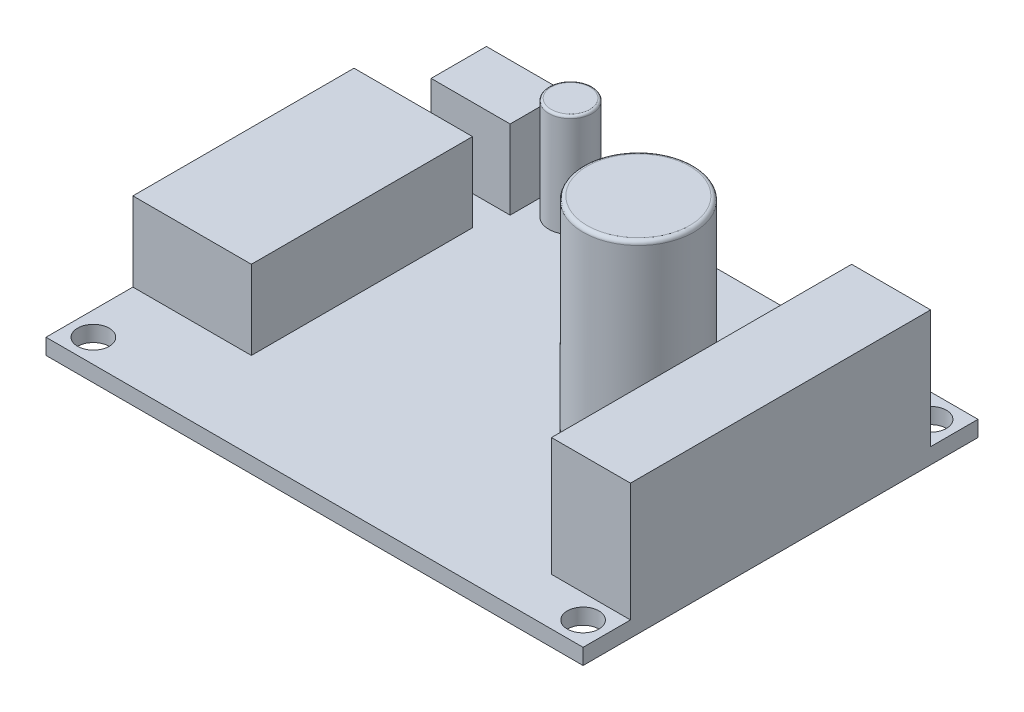
ISO-10303-21;
HEADER;
FILE_DESCRIPTION(('STEP AP214'),'2;1');
FILE_NAME('part.step','',(''),(''),'','','');
FILE_SCHEMA(('AUTOMOTIVE_DESIGN { 1 0 10303 214 1 1 1 1 }'));
ENDSEC;
DATA;
#1=APPLICATION_CONTEXT('core data for automotive mechanical design processes');
#2=APPLICATION_PROTOCOL_DEFINITION('international standard','automotive_design',2000,#1);
#3=PRODUCT_CONTEXT('',#1,'mechanical');
#4=PRODUCT('Part','Part','',(#3));
#5=PRODUCT_RELATED_PRODUCT_CATEGORY('part','',(#4));
#6=PRODUCT_DEFINITION_FORMATION('','',#4);
#7=PRODUCT_DEFINITION_CONTEXT('part definition',#1,'design');
#8=PRODUCT_DEFINITION('design','',#6,#7);
#9=PRODUCT_DEFINITION_SHAPE('','',#8);
#10=(LENGTH_UNIT() NAMED_UNIT(*) SI_UNIT(.MILLI.,.METRE.));
#11=(NAMED_UNIT(*) PLANE_ANGLE_UNIT() SI_UNIT($,.RADIAN.));
#12=(NAMED_UNIT(*) SI_UNIT($,.STERADIAN.) SOLID_ANGLE_UNIT());
#13=UNCERTAINTY_MEASURE_WITH_UNIT(LENGTH_MEASURE(1.E-05),#10,'distance_accuracy_value','');
#14=(GEOMETRIC_REPRESENTATION_CONTEXT(3) GLOBAL_UNCERTAINTY_ASSIGNED_CONTEXT((#13)) GLOBAL_UNIT_ASSIGNED_CONTEXT((#10,
#11,#12)) REPRESENTATION_CONTEXT('',''));
#15=CARTESIAN_POINT('',(0.,0.,0.));
#16=DIRECTION('',(0.,0.,1.));
#17=DIRECTION('',(1.,0.,0.));
#18=AXIS2_PLACEMENT_3D('',#15,#16,#17);
#19=CARTESIAN_POINT('',(0.,2.,0.));
#20=DIRECTION('',(0.,-1.,0.));
#21=DIRECTION('',(0.,0.,-1.));
#22=AXIS2_PLACEMENT_3D('',#19,#20,#21);
#23=PLANE('',#22);
#24=CARTESIAN_POINT('',(-14.,2.,-21.4113766525952));
#25=DIRECTION('',(0.,-1.,0.));
#26=DIRECTION('',(0.,0.,-1.));
#27=AXIS2_PLACEMENT_3D('',#24,#25,#26);
#28=CIRCLE('',#27,2.75);
#29=CARTESIAN_POINT('',(-14.,2.,-24.1613766525952));
#30=VERTEX_POINT('',#29);
#31=EDGE_CURVE('E295',#30,#30,#28,.F.);
#32=ORIENTED_EDGE('',*,*,#31,.F.);
#33=EDGE_LOOP('',(#32));
#34=FACE_BOUND('',#33,.T.);
#35=DIRECTION('',(-1.,0.,0.));
#36=VECTOR('',#35,1.);
#37=CARTESIAN_POINT('',(-34.,2.,-14.));
#38=LINE('',#37,#36);
#39=CARTESIAN_POINT('',(-19.,2.,-14.));
#40=VERTEX_POINT('',#39);
#41=CARTESIAN_POINT('',(-34.,2.,-14.));
#42=VERTEX_POINT('',#41);
#43=EDGE_CURVE('E169',#40,#42,#38,.T.);
#44=ORIENTED_EDGE('',*,*,#43,.F.);
#45=DIRECTION('',(0.,0.,-1.));
#46=VECTOR('',#45,1.);
#47=CARTESIAN_POINT('',(-19.,2.,14.));
#48=LINE('',#47,#46);
#49=CARTESIAN_POINT('',(-19.,2.,14.));
#50=VERTEX_POINT('',#49);
#51=EDGE_CURVE('E166',#50,#40,#48,.T.);
#52=ORIENTED_EDGE('',*,*,#51,.F.);
#53=DIRECTION('',(1.,0.,0.));
#54=VECTOR('',#53,1.);
#55=CARTESIAN_POINT('',(-34.,2.,14.));
#56=LINE('',#55,#54);
#57=CARTESIAN_POINT('',(-34.,2.,14.));
#58=VERTEX_POINT('',#57);
#59=EDGE_CURVE('E179',#58,#50,#56,.T.);
#60=ORIENTED_EDGE('',*,*,#59,.F.);
#61=DIRECTION('',(0.,0.,1.));
#62=VECTOR('',#61,1.);
#63=CARTESIAN_POINT('',(-34.,2.,25.));
#64=LINE('',#63,#62);
#65=CARTESIAN_POINT('',(-34.,2.,25.));
#66=VERTEX_POINT('',#65);
#67=EDGE_CURVE('E261',#58,#66,#64,.T.);
#68=ORIENTED_EDGE('',*,*,#67,.T.);
#69=DIRECTION('',(1.,0.,0.));
#70=VECTOR('',#69,1.);
#71=CARTESIAN_POINT('',(-34.,2.,25.));
#72=LINE('',#71,#70);
#73=CARTESIAN_POINT('',(34.,2.,25.));
#74=VERTEX_POINT('',#73);
#75=EDGE_CURVE('E264',#66,#74,#72,.T.);
#76=ORIENTED_EDGE('',*,*,#75,.T.);
#77=DIRECTION('',(0.,0.,-1.));
#78=VECTOR('',#77,1.);
#79=CARTESIAN_POINT('',(34.,2.,25.));
#80=LINE('',#79,#78);
#81=CARTESIAN_POINT('',(34.,2.,19.));
#82=VERTEX_POINT('',#81);
#83=EDGE_CURVE('E256',#74,#82,#80,.T.);
#84=ORIENTED_EDGE('',*,*,#83,.T.);
#85=DIRECTION('',(1.,0.,0.));
#86=VECTOR('',#85,1.);
#87=CARTESIAN_POINT('',(24.,2.,19.));
#88=LINE('',#87,#86);
#89=CARTESIAN_POINT('',(24.,2.,19.));
#90=VERTEX_POINT('',#89);
#91=EDGE_CURVE('E201',#90,#82,#88,.T.);
#92=ORIENTED_EDGE('',*,*,#91,.F.);
#93=DIRECTION('',(0.,0.,1.));
#94=VECTOR('',#93,1.);
#95=CARTESIAN_POINT('',(24.,2.,19.));
#96=LINE('',#95,#94);
#97=CARTESIAN_POINT('',(24.,2.,-19.));
#98=VERTEX_POINT('',#97);
#99=EDGE_CURVE('E206',#98,#90,#96,.T.);
#100=ORIENTED_EDGE('',*,*,#99,.F.);
#101=DIRECTION('',(-1.,0.,0.));
#102=VECTOR('',#101,1.);
#103=CARTESIAN_POINT('',(24.,2.,-19.));
#104=LINE('',#103,#102);
#105=CARTESIAN_POINT('',(34.,2.,-19.));
#106=VERTEX_POINT('',#105);
#107=EDGE_CURVE('E215',#106,#98,#104,.T.);
#108=ORIENTED_EDGE('',*,*,#107,.F.);
#109=CARTESIAN_POINT('',(34.,2.,-25.));
#110=VERTEX_POINT('',#109);
#111=EDGE_CURVE('E259',#106,#110,#80,.T.);
#112=ORIENTED_EDGE('',*,*,#111,.T.);
#113=DIRECTION('',(-1.,0.,0.));
#114=VECTOR('',#113,1.);
#115=CARTESIAN_POINT('',(-34.,2.,-25.));
#116=LINE('',#115,#114);
#117=CARTESIAN_POINT('',(-34.,2.,-25.));
#118=VERTEX_POINT('',#117);
#119=EDGE_CURVE('E258',#110,#118,#116,.T.);
#120=ORIENTED_EDGE('',*,*,#119,.T.);
#121=EDGE_CURVE('E262',#118,#42,#64,.T.);
#122=ORIENTED_EDGE('',*,*,#121,.T.);
#123=EDGE_LOOP('',(#44,#52,#60,#68,#76,#84,#92,#100,#108,#112,#120,#122));
#124=FACE_BOUND('',#123,.T.);
#125=CARTESIAN_POINT('',(-31.,2.,22.));
#126=DIRECTION('',(0.,1.,0.));
#127=DIRECTION('',(0.,0.,-1.));
#128=AXIS2_PLACEMENT_3D('',#125,#126,#127);
#129=CIRCLE('',#128,2.);
#130=CARTESIAN_POINT('',(-31.,2.,20.));
#131=VERTEX_POINT('',#130);
#132=EDGE_CURVE('E232',#131,#131,#129,.T.);
#133=ORIENTED_EDGE('',*,*,#132,.F.);
#134=EDGE_LOOP('',(#133));
#135=FACE_BOUND('',#134,.T.);
#136=CARTESIAN_POINT('',(31.,2.,22.));
#137=DIRECTION('',(0.,1.,0.));
#138=DIRECTION('',(0.,0.,1.));
#139=AXIS2_PLACEMENT_3D('',#136,#137,#138);
#140=CIRCLE('',#139,2.);
#141=CARTESIAN_POINT('',(31.,2.,24.));
#142=VERTEX_POINT('',#141);
#143=EDGE_CURVE('E238',#142,#142,#140,.T.);
#144=ORIENTED_EDGE('',*,*,#143,.F.);
#145=EDGE_LOOP('',(#144));
#146=FACE_BOUND('',#145,.T.);
#147=CARTESIAN_POINT('',(31.,2.,-22.));
#148=DIRECTION('',(0.,1.,0.));
#149=DIRECTION('',(0.,0.,-1.));
#150=AXIS2_PLACEMENT_3D('',#147,#148,#149);
#151=CIRCLE('',#150,2.);
#152=CARTESIAN_POINT('',(31.,2.,-24.));
#153=VERTEX_POINT('',#152);
#154=EDGE_CURVE('E244',#153,#153,#151,.T.);
#155=ORIENTED_EDGE('',*,*,#154,.F.);
#156=EDGE_LOOP('',(#155));
#157=FACE_BOUND('',#156,.T.);
#158=CARTESIAN_POINT('',(-31.,2.,-22.));
#159=DIRECTION('',(0.,1.,0.));
#160=DIRECTION('',(0.,0.,1.));
#161=AXIS2_PLACEMENT_3D('',#158,#159,#160);
#162=CIRCLE('',#161,2.);
#163=CARTESIAN_POINT('',(-31.,2.,-20.));
#164=VERTEX_POINT('',#163);
#165=EDGE_CURVE('E250',#164,#164,#162,.T.);
#166=ORIENTED_EDGE('',*,*,#165,.F.);
#167=EDGE_LOOP('',(#166));
#168=FACE_BOUND('',#167,.T.);
#169=CARTESIAN_POINT('',(16.,2.,0.));
#170=DIRECTION('',(0.,-1.,0.));
#171=DIRECTION('',(0.,0.,-1.));
#172=AXIS2_PLACEMENT_3D('',#169,#170,#171);
#173=CIRCLE('',#172,7.);
#174=CARTESIAN_POINT('',(16.,2.,-7.));
#175=VERTEX_POINT('',#174);
#176=EDGE_CURVE('E286',#175,#175,#173,.F.);
#177=ORIENTED_EDGE('',*,*,#176,.F.);
#178=EDGE_LOOP('',(#177));
#179=FACE_BOUND('',#178,.T.);
#180=DIRECTION('',(0.,0.,-1.));
#181=VECTOR('',#180,1.);
#182=CARTESIAN_POINT('',(-18.0015410763829,2.,-17.7629399990859));
#183=LINE('',#182,#181);
#184=CARTESIAN_POINT('',(-18.0015410763829,2.,-17.7629399990859));
#185=VERTEX_POINT('',#184);
#186=CARTESIAN_POINT('',(-18.0015410763829,2.,-24.7629399990859));
#187=VERTEX_POINT('',#186);
#188=EDGE_CURVE('E165',#185,#187,#183,.T.);
#189=ORIENTED_EDGE('',*,*,#188,.F.);
#190=DIRECTION('',(1.,0.,0.));
#191=VECTOR('',#190,1.);
#192=CARTESIAN_POINT('',(-28.0015410763829,2.,-17.7629399990859));
#193=LINE('',#192,#191);
#194=CARTESIAN_POINT('',(-28.0015410763829,2.,-17.7629399990859));
#195=VERTEX_POINT('',#194);
#196=EDGE_CURVE('E162',#195,#185,#193,.T.);
#197=ORIENTED_EDGE('',*,*,#196,.F.);
#198=DIRECTION('',(0.,0.,1.));
#199=VECTOR('',#198,1.);
#200=CARTESIAN_POINT('',(-28.0015410763829,2.,-17.7629399990859));
#201=LINE('',#200,#199);
#202=CARTESIAN_POINT('',(-28.0015410763829,2.,-24.7629399990859));
#203=VERTEX_POINT('',#202);
#204=EDGE_CURVE('E52',#203,#195,#201,.T.);
#205=ORIENTED_EDGE('',*,*,#204,.F.);
#206=DIRECTION('',(-1.,0.,0.));
#207=VECTOR('',#206,1.);
#208=CARTESIAN_POINT('',(-28.0015410763829,2.,-24.7629399990859));
#209=LINE('',#208,#207);
#210=EDGE_CURVE('E47',#187,#203,#209,.T.);
#211=ORIENTED_EDGE('',*,*,#210,.F.);
#212=EDGE_LOOP('',(#189,#197,#205,#211));
#213=FACE_BOUND('',#212,.T.);
#214=ADVANCED_FACE('F32',(#34,#124,#135,#146,#157,#168,#179,#213),#23,.F.);
#215=CARTESIAN_POINT('',(0.,0.,0.));
#216=DIRECTION('',(0.,-1.,0.));
#217=DIRECTION('',(0.,0.,-1.));
#218=AXIS2_PLACEMENT_3D('',#215,#216,#217);
#219=PLANE('',#218);
#220=CARTESIAN_POINT('',(31.,0.,22.));
#221=DIRECTION('',(0.,1.,0.));
#222=DIRECTION('',(0.,0.,1.));
#223=AXIS2_PLACEMENT_3D('',#220,#221,#222);
#224=CIRCLE('',#223,2.);
#225=CARTESIAN_POINT('',(31.,0.,24.));
#226=VERTEX_POINT('',#225);
#227=EDGE_CURVE('E235',#226,#226,#224,.T.);
#228=ORIENTED_EDGE('',*,*,#227,.T.);
#229=EDGE_LOOP('',(#228));
#230=FACE_BOUND('',#229,.T.);
#231=CARTESIAN_POINT('',(-31.,0.,-22.));
#232=DIRECTION('',(0.,1.,0.));
#233=DIRECTION('',(0.,0.,1.));
#234=AXIS2_PLACEMENT_3D('',#231,#232,#233);
#235=CIRCLE('',#234,2.);
#236=CARTESIAN_POINT('',(-31.,0.,-20.));
#237=VERTEX_POINT('',#236);
#238=EDGE_CURVE('E247',#237,#237,#235,.T.);
#239=ORIENTED_EDGE('',*,*,#238,.T.);
#240=EDGE_LOOP('',(#239));
#241=FACE_BOUND('',#240,.T.);
#242=DIRECTION('',(0.,0.,-1.));
#243=VECTOR('',#242,1.);
#244=CARTESIAN_POINT('',(34.,0.,25.));
#245=LINE('',#244,#243);
#246=CARTESIAN_POINT('',(34.,0.,25.));
#247=VERTEX_POINT('',#246);
#248=CARTESIAN_POINT('',(34.,0.,-25.));
#249=VERTEX_POINT('',#248);
#250=EDGE_CURVE('E253',#247,#249,#245,.T.);
#251=ORIENTED_EDGE('',*,*,#250,.F.);
#252=DIRECTION('',(1.,0.,0.));
#253=VECTOR('',#252,1.);
#254=CARTESIAN_POINT('',(-34.,0.,25.));
#255=LINE('',#254,#253);
#256=CARTESIAN_POINT('',(-34.,0.,25.));
#257=VERTEX_POINT('',#256);
#258=EDGE_CURVE('E273',#257,#247,#255,.T.);
#259=ORIENTED_EDGE('',*,*,#258,.F.);
#260=DIRECTION('',(0.,0.,1.));
#261=VECTOR('',#260,1.);
#262=CARTESIAN_POINT('',(-34.,0.,25.));
#263=LINE('',#262,#261);
#264=CARTESIAN_POINT('',(-34.,0.,-25.));
#265=VERTEX_POINT('',#264);
#266=EDGE_CURVE('E271',#265,#257,#263,.T.);
#267=ORIENTED_EDGE('',*,*,#266,.F.);
#268=DIRECTION('',(-1.,0.,0.));
#269=VECTOR('',#268,1.);
#270=CARTESIAN_POINT('',(-34.,0.,-25.));
#271=LINE('',#270,#269);
#272=EDGE_CURVE('E269',#249,#265,#271,.T.);
#273=ORIENTED_EDGE('',*,*,#272,.F.);
#274=EDGE_LOOP('',(#251,#259,#267,#273));
#275=FACE_BOUND('',#274,.T.);
#276=CARTESIAN_POINT('',(31.,0.,-22.));
#277=DIRECTION('',(0.,1.,0.));
#278=DIRECTION('',(0.,0.,-1.));
#279=AXIS2_PLACEMENT_3D('',#276,#277,#278);
#280=CIRCLE('',#279,2.);
#281=CARTESIAN_POINT('',(31.,0.,-24.));
#282=VERTEX_POINT('',#281);
#283=EDGE_CURVE('E241',#282,#282,#280,.T.);
#284=ORIENTED_EDGE('',*,*,#283,.T.);
#285=EDGE_LOOP('',(#284));
#286=FACE_BOUND('',#285,.T.);
#287=CARTESIAN_POINT('',(-31.,0.,22.));
#288=DIRECTION('',(0.,1.,0.));
#289=DIRECTION('',(0.,0.,-1.));
#290=AXIS2_PLACEMENT_3D('',#287,#288,#289);
#291=CIRCLE('',#290,2.);
#292=CARTESIAN_POINT('',(-31.,0.,20.));
#293=VERTEX_POINT('',#292);
#294=EDGE_CURVE('E231',#293,#293,#291,.T.);
#295=ORIENTED_EDGE('',*,*,#294,.T.);
#296=EDGE_LOOP('',(#295));
#297=FACE_BOUND('',#296,.T.);
#298=ADVANCED_FACE('F311',(#230,#241,#275,#286,#297),#219,.T.);
#299=CARTESIAN_POINT('',(34.,2.,25.));
#300=DIRECTION('',(-1.,0.,0.));
#301=DIRECTION('',(0.,0.,1.));
#302=AXIS2_PLACEMENT_3D('',#299,#300,#301);
#303=PLANE('',#302);
#304=ORIENTED_EDGE('',*,*,#250,.T.);
#305=DIRECTION('',(0.,-1.,0.));
#306=VECTOR('',#305,1.);
#307=CARTESIAN_POINT('',(34.,2.,-25.));
#308=LINE('',#307,#306);
#309=EDGE_CURVE('E283',#110,#249,#308,.T.);
#310=ORIENTED_EDGE('',*,*,#309,.F.);
#311=ORIENTED_EDGE('',*,*,#111,.F.);
#312=DIRECTION('',(0.,-1.,0.));
#313=VECTOR('',#312,1.);
#314=CARTESIAN_POINT('',(34.,17.,-19.));
#315=LINE('',#314,#313);
#316=CARTESIAN_POINT('',(34.,17.,-19.));
#317=VERTEX_POINT('',#316);
#318=EDGE_CURVE('E225',#317,#106,#315,.T.);
#319=ORIENTED_EDGE('',*,*,#318,.F.);
#320=DIRECTION('',(0.,0.,-1.));
#321=VECTOR('',#320,1.);
#322=CARTESIAN_POINT('',(34.,17.,19.));
#323=LINE('',#322,#321);
#324=CARTESIAN_POINT('',(34.,17.,19.));
#325=VERTEX_POINT('',#324);
#326=EDGE_CURVE('E205',#325,#317,#323,.T.);
#327=ORIENTED_EDGE('',*,*,#326,.F.);
#328=DIRECTION('',(0.,-1.,0.));
#329=VECTOR('',#328,1.);
#330=CARTESIAN_POINT('',(34.,17.,19.));
#331=LINE('',#330,#329);
#332=EDGE_CURVE('E228',#325,#82,#331,.T.);
#333=ORIENTED_EDGE('',*,*,#332,.T.);
#334=ORIENTED_EDGE('',*,*,#83,.F.);
#335=DIRECTION('',(0.,-1.,0.));
#336=VECTOR('',#335,1.);
#337=CARTESIAN_POINT('',(34.,2.,25.));
#338=LINE('',#337,#336);
#339=EDGE_CURVE('E266',#74,#247,#338,.T.);
#340=ORIENTED_EDGE('',*,*,#339,.T.);
#341=EDGE_LOOP('',(#304,#310,#311,#319,#327,#333,#334,#340));
#342=FACE_BOUND('',#341,.T.);
#343=ADVANCED_FACE('F317',(#342),#303,.F.);
#344=CARTESIAN_POINT('',(-34.,2.,-25.));
#345=DIRECTION('',(0.,0.,1.));
#346=DIRECTION('',(1.,0.,0.));
#347=AXIS2_PLACEMENT_3D('',#344,#345,#346);
#348=PLANE('',#347);
#349=ORIENTED_EDGE('',*,*,#272,.T.);
#350=DIRECTION('',(0.,-1.,0.));
#351=VECTOR('',#350,1.);
#352=CARTESIAN_POINT('',(-34.,2.,-25.));
#353=LINE('',#352,#351);
#354=EDGE_CURVE('E280',#118,#265,#353,.T.);
#355=ORIENTED_EDGE('',*,*,#354,.F.);
#356=ORIENTED_EDGE('',*,*,#119,.F.);
#357=ORIENTED_EDGE('',*,*,#309,.T.);
#358=EDGE_LOOP('',(#349,#355,#356,#357));
#359=FACE_BOUND('',#358,.T.);
#360=ADVANCED_FACE('F333',(#359),#348,.F.);
#361=CARTESIAN_POINT('',(-34.,2.,25.));
#362=DIRECTION('',(1.,0.,0.));
#363=DIRECTION('',(0.,0.,-1.));
#364=AXIS2_PLACEMENT_3D('',#361,#362,#363);
#365=PLANE('',#364);
#366=ORIENTED_EDGE('',*,*,#266,.T.);
#367=DIRECTION('',(0.,-1.,0.));
#368=VECTOR('',#367,1.);
#369=CARTESIAN_POINT('',(-34.,2.,25.));
#370=LINE('',#369,#368);
#371=EDGE_CURVE('E277',#66,#257,#370,.T.);
#372=ORIENTED_EDGE('',*,*,#371,.F.);
#373=ORIENTED_EDGE('',*,*,#67,.F.);
#374=DIRECTION('',(0.,-1.,0.));
#375=VECTOR('',#374,1.);
#376=CARTESIAN_POINT('',(-34.,12.,14.));
#377=LINE('',#376,#375);
#378=CARTESIAN_POINT('',(-34.,12.,14.));
#379=VERTEX_POINT('',#378);
#380=EDGE_CURVE('E192',#379,#58,#377,.T.);
#381=ORIENTED_EDGE('',*,*,#380,.F.);
#382=DIRECTION('',(0.,0.,1.));
#383=VECTOR('',#382,1.);
#384=CARTESIAN_POINT('',(-34.,12.,14.));
#385=LINE('',#384,#383);
#386=CARTESIAN_POINT('',(-34.,12.,-14.));
#387=VERTEX_POINT('',#386);
#388=EDGE_CURVE('E181',#387,#379,#385,.T.);
#389=ORIENTED_EDGE('',*,*,#388,.F.);
#390=DIRECTION('',(0.,-1.,0.));
#391=VECTOR('',#390,1.);
#392=CARTESIAN_POINT('',(-34.,12.,-14.));
#393=LINE('',#392,#391);
#394=EDGE_CURVE('E195',#387,#42,#393,.T.);
#395=ORIENTED_EDGE('',*,*,#394,.T.);
#396=ORIENTED_EDGE('',*,*,#121,.F.);
#397=ORIENTED_EDGE('',*,*,#354,.T.);
#398=EDGE_LOOP('',(#366,#372,#373,#381,#389,#395,#396,#397));
#399=FACE_BOUND('',#398,.T.);
#400=ADVANCED_FACE('F329',(#399),#365,.F.);
#401=CARTESIAN_POINT('',(-34.,2.,25.));
#402=DIRECTION('',(0.,0.,-1.));
#403=DIRECTION('',(-1.,0.,0.));
#404=AXIS2_PLACEMENT_3D('',#401,#402,#403);
#405=PLANE('',#404);
#406=ORIENTED_EDGE('',*,*,#258,.T.);
#407=ORIENTED_EDGE('',*,*,#339,.F.);
#408=ORIENTED_EDGE('',*,*,#75,.F.);
#409=ORIENTED_EDGE('',*,*,#371,.T.);
#410=EDGE_LOOP('',(#406,#407,#408,#409));
#411=FACE_BOUND('',#410,.T.);
#412=ADVANCED_FACE('F326',(#411),#405,.F.);
#413=CARTESIAN_POINT('',(-31.,2.,-22.));
#414=DIRECTION('',(0.,-1.,0.));
#415=DIRECTION('',(0.,0.,-1.));
#416=AXIS2_PLACEMENT_3D('',#413,#414,#415);
#417=CYLINDRICAL_SURFACE('',#416,2.);
#418=ORIENTED_EDGE('',*,*,#165,.T.);
#419=EDGE_LOOP('',(#418));
#420=FACE_BOUND('',#419,.T.);
#421=ORIENTED_EDGE('',*,*,#238,.F.);
#422=EDGE_LOOP('',(#421));
#423=FACE_BOUND('',#422,.T.);
#424=ADVANCED_FACE('F323',(#420,#423),#417,.F.);
#425=CARTESIAN_POINT('',(31.,2.,-22.));
#426=DIRECTION('',(0.,-1.,0.));
#427=DIRECTION('',(0.,0.,-1.));
#428=AXIS2_PLACEMENT_3D('',#425,#426,#427);
#429=CYLINDRICAL_SURFACE('',#428,2.);
#430=ORIENTED_EDGE('',*,*,#154,.T.);
#431=EDGE_LOOP('',(#430));
#432=FACE_BOUND('',#431,.T.);
#433=ORIENTED_EDGE('',*,*,#283,.F.);
#434=EDGE_LOOP('',(#433));
#435=FACE_BOUND('',#434,.T.);
#436=ADVANCED_FACE('F424',(#432,#435),#429,.F.);
#437=CARTESIAN_POINT('',(31.,2.,22.));
#438=DIRECTION('',(0.,-1.,0.));
#439=DIRECTION('',(0.,0.,-1.));
#440=AXIS2_PLACEMENT_3D('',#437,#438,#439);
#441=CYLINDRICAL_SURFACE('',#440,2.);
#442=ORIENTED_EDGE('',*,*,#143,.T.);
#443=EDGE_LOOP('',(#442));
#444=FACE_BOUND('',#443,.T.);
#445=ORIENTED_EDGE('',*,*,#227,.F.);
#446=EDGE_LOOP('',(#445));
#447=FACE_BOUND('',#446,.T.);
#448=ADVANCED_FACE('F421',(#444,#447),#441,.F.);
#449=CARTESIAN_POINT('',(-31.,2.,22.));
#450=DIRECTION('',(0.,-1.,0.));
#451=DIRECTION('',(0.,0.,-1.));
#452=AXIS2_PLACEMENT_3D('',#449,#450,#451);
#453=CYLINDRICAL_SURFACE('',#452,2.);
#454=ORIENTED_EDGE('',*,*,#132,.T.);
#455=EDGE_LOOP('',(#454));
#456=FACE_BOUND('',#455,.T.);
#457=ORIENTED_EDGE('',*,*,#294,.F.);
#458=EDGE_LOOP('',(#457));
#459=FACE_BOUND('',#458,.T.);
#460=ADVANCED_FACE('F361',(#456,#459),#453,.F.);
#461=CARTESIAN_POINT('',(16.,30.,0.));
#462=DIRECTION('',(0.,-1.,0.));
#463=DIRECTION('',(0.,0.,-1.));
#464=AXIS2_PLACEMENT_3D('',#461,#462,#463);
#465=CYLINDRICAL_SURFACE('',#464,7.);
#466=CARTESIAN_POINT('',(16.,29.5,0.));
#467=DIRECTION('',(0.,1.,0.));
#468=DIRECTION('',(0.,0.,1.));
#469=AXIS2_PLACEMENT_3D('',#466,#467,#468);
#470=CIRCLE('',#469,7.);
#471=CARTESIAN_POINT('',(16.,29.5,7.));
#472=VERTEX_POINT('',#471);
#473=EDGE_CURVE('E292',#472,#472,#470,.F.);
#474=ORIENTED_EDGE('',*,*,#473,.T.);
#475=EDGE_LOOP('',(#474));
#476=FACE_BOUND('',#475,.T.);
#477=ORIENTED_EDGE('',*,*,#176,.T.);
#478=EDGE_LOOP('',(#477));
#479=FACE_BOUND('',#478,.T.);
#480=ADVANCED_FACE('F352',(#476,#479),#465,.T.);
#481=CARTESIAN_POINT('',(16.,30.,0.));
#482=DIRECTION('',(0.,1.,0.));
#483=DIRECTION('',(0.,0.,1.));
#484=AXIS2_PLACEMENT_3D('',#481,#482,#483);
#485=PLANE('',#484);
#486=CARTESIAN_POINT('',(16.,30.,0.));
#487=DIRECTION('',(0.,1.,0.));
#488=DIRECTION('',(0.,0.,1.));
#489=AXIS2_PLACEMENT_3D('',#486,#487,#488);
#490=CIRCLE('',#489,6.5);
#491=CARTESIAN_POINT('',(16.,30.,6.5));
#492=VERTEX_POINT('',#491);
#493=EDGE_CURVE('E289',#492,#492,#490,.T.);
#494=ORIENTED_EDGE('',*,*,#493,.T.);
#495=EDGE_LOOP('',(#494));
#496=FACE_BOUND('',#495,.T.);
#497=ADVANCED_FACE('F343',(#496),#485,.T.);
#498=CARTESIAN_POINT('',(16.,29.5,0.));
#499=DIRECTION('',(0.,1.,0.));
#500=DIRECTION('',(0.,0.,1.));
#501=AXIS2_PLACEMENT_3D('',#498,#499,#500);
#502=TOROIDAL_SURFACE('',#501,6.5,0.5);
#503=ORIENTED_EDGE('',*,*,#473,.F.);
#504=EDGE_LOOP('',(#503));
#505=FACE_BOUND('',#504,.T.);
#506=ORIENTED_EDGE('',*,*,#493,.F.);
#507=EDGE_LOOP('',(#506));
#508=FACE_BOUND('',#507,.T.);
#509=ADVANCED_FACE('F340',(#505,#508),#502,.T.);
#510=CARTESIAN_POINT('',(24.,17.,19.));
#511=DIRECTION('',(0.,0.,-1.));
#512=DIRECTION('',(-1.,0.,0.));
#513=AXIS2_PLACEMENT_3D('',#510,#511,#512);
#514=PLANE('',#513);
#515=ORIENTED_EDGE('',*,*,#91,.T.);
#516=ORIENTED_EDGE('',*,*,#332,.F.);
#517=DIRECTION('',(1.,0.,0.));
#518=VECTOR('',#517,1.);
#519=CARTESIAN_POINT('',(24.,17.,19.));
#520=LINE('',#519,#518);
#521=CARTESIAN_POINT('',(24.,17.,19.));
#522=VERTEX_POINT('',#521);
#523=EDGE_CURVE('E202',#522,#325,#520,.T.);
#524=ORIENTED_EDGE('',*,*,#523,.F.);
#525=DIRECTION('',(0.,-1.,0.));
#526=VECTOR('',#525,1.);
#527=CARTESIAN_POINT('',(24.,17.,19.));
#528=LINE('',#527,#526);
#529=EDGE_CURVE('E212',#522,#90,#528,.T.);
#530=ORIENTED_EDGE('',*,*,#529,.T.);
#531=EDGE_LOOP('',(#515,#516,#524,#530));
#532=FACE_BOUND('',#531,.T.);
#533=ADVANCED_FACE('F342',(#532),#514,.F.);
#534=CARTESIAN_POINT('',(24.,17.,-19.));
#535=DIRECTION('',(0.,0.,1.));
#536=DIRECTION('',(1.,0.,0.));
#537=AXIS2_PLACEMENT_3D('',#534,#535,#536);
#538=PLANE('',#537);
#539=ORIENTED_EDGE('',*,*,#107,.T.);
#540=DIRECTION('',(0.,-1.,0.));
#541=VECTOR('',#540,1.);
#542=CARTESIAN_POINT('',(24.,17.,-19.));
#543=LINE('',#542,#541);
#544=CARTESIAN_POINT('',(24.,17.,-19.));
#545=VERTEX_POINT('',#544);
#546=EDGE_CURVE('E222',#545,#98,#543,.T.);
#547=ORIENTED_EDGE('',*,*,#546,.F.);
#548=DIRECTION('',(-1.,0.,0.));
#549=VECTOR('',#548,1.);
#550=CARTESIAN_POINT('',(24.,17.,-19.));
#551=LINE('',#550,#549);
#552=EDGE_CURVE('E208',#317,#545,#551,.T.);
#553=ORIENTED_EDGE('',*,*,#552,.F.);
#554=ORIENTED_EDGE('',*,*,#318,.T.);
#555=EDGE_LOOP('',(#539,#547,#553,#554));
#556=FACE_BOUND('',#555,.T.);
#557=ADVANCED_FACE('F349',(#556),#538,.F.);
#558=CARTESIAN_POINT('',(24.,17.,19.));
#559=DIRECTION('',(1.,0.,0.));
#560=DIRECTION('',(0.,0.,-1.));
#561=AXIS2_PLACEMENT_3D('',#558,#559,#560);
#562=PLANE('',#561);
#563=ORIENTED_EDGE('',*,*,#99,.T.);
#564=ORIENTED_EDGE('',*,*,#529,.F.);
#565=DIRECTION('',(0.,0.,1.));
#566=VECTOR('',#565,1.);
#567=CARTESIAN_POINT('',(24.,17.,19.));
#568=LINE('',#567,#566);
#569=EDGE_CURVE('E210',#545,#522,#568,.T.);
#570=ORIENTED_EDGE('',*,*,#569,.F.);
#571=ORIENTED_EDGE('',*,*,#546,.T.);
#572=EDGE_LOOP('',(#563,#564,#570,#571));
#573=FACE_BOUND('',#572,.T.);
#574=ADVANCED_FACE('F411',(#573),#562,.F.);
#575=CARTESIAN_POINT('',(0.,17.,0.));
#576=DIRECTION('',(0.,1.,0.));
#577=DIRECTION('',(0.,0.,1.));
#578=AXIS2_PLACEMENT_3D('',#575,#576,#577);
#579=PLANE('',#578);
#580=ORIENTED_EDGE('',*,*,#523,.T.);
#581=ORIENTED_EDGE('',*,*,#326,.T.);
#582=ORIENTED_EDGE('',*,*,#552,.T.);
#583=ORIENTED_EDGE('',*,*,#569,.T.);
#584=EDGE_LOOP('',(#580,#581,#582,#583));
#585=FACE_BOUND('',#584,.T.);
#586=ADVANCED_FACE('F407',(#585),#579,.T.);
#587=CARTESIAN_POINT('',(-19.,12.,14.));
#588=DIRECTION('',(-1.,0.,0.));
#589=DIRECTION('',(0.,0.,1.));
#590=AXIS2_PLACEMENT_3D('',#587,#588,#589);
#591=PLANE('',#590);
#592=ORIENTED_EDGE('',*,*,#51,.T.);
#593=DIRECTION('',(0.,-1.,0.));
#594=VECTOR('',#593,1.);
#595=CARTESIAN_POINT('',(-19.,12.,-14.));
#596=LINE('',#595,#594);
#597=CARTESIAN_POINT('',(-19.,12.,-14.));
#598=VERTEX_POINT('',#597);
#599=EDGE_CURVE('E198',#598,#40,#596,.T.);
#600=ORIENTED_EDGE('',*,*,#599,.F.);
#601=DIRECTION('',(0.,0.,-1.));
#602=VECTOR('',#601,1.);
#603=CARTESIAN_POINT('',(-19.,12.,14.));
#604=LINE('',#603,#602);
#605=CARTESIAN_POINT('',(-19.,12.,14.));
#606=VERTEX_POINT('',#605);
#607=EDGE_CURVE('E175',#606,#598,#604,.T.);
#608=ORIENTED_EDGE('',*,*,#607,.F.);
#609=DIRECTION('',(0.,-1.,0.));
#610=VECTOR('',#609,1.);
#611=CARTESIAN_POINT('',(-19.,12.,14.));
#612=LINE('',#611,#610);
#613=EDGE_CURVE('E184',#606,#50,#612,.T.);
#614=ORIENTED_EDGE('',*,*,#613,.T.);
#615=EDGE_LOOP('',(#592,#600,#608,#614));
#616=FACE_BOUND('',#615,.T.);
#617=ADVANCED_FACE('F403',(#616),#591,.F.);
#618=CARTESIAN_POINT('',(-34.,12.,-14.));
#619=DIRECTION('',(0.,0.,1.));
#620=DIRECTION('',(1.,0.,0.));
#621=AXIS2_PLACEMENT_3D('',#618,#619,#620);
#622=PLANE('',#621);
#623=ORIENTED_EDGE('',*,*,#43,.T.);
#624=ORIENTED_EDGE('',*,*,#394,.F.);
#625=DIRECTION('',(-1.,0.,0.));
#626=VECTOR('',#625,1.);
#627=CARTESIAN_POINT('',(-34.,12.,-14.));
#628=LINE('',#627,#626);
#629=EDGE_CURVE('E178',#598,#387,#628,.T.);
#630=ORIENTED_EDGE('',*,*,#629,.F.);
#631=ORIENTED_EDGE('',*,*,#599,.T.);
#632=EDGE_LOOP('',(#623,#624,#630,#631));
#633=FACE_BOUND('',#632,.T.);
#634=ADVANCED_FACE('F399',(#633),#622,.F.);
#635=CARTESIAN_POINT('',(-34.,12.,14.));
#636=DIRECTION('',(0.,0.,-1.));
#637=DIRECTION('',(-1.,0.,0.));
#638=AXIS2_PLACEMENT_3D('',#635,#636,#637);
#639=PLANE('',#638);
#640=ORIENTED_EDGE('',*,*,#59,.T.);
#641=ORIENTED_EDGE('',*,*,#613,.F.);
#642=DIRECTION('',(1.,0.,0.));
#643=VECTOR('',#642,1.);
#644=CARTESIAN_POINT('',(-34.,12.,14.));
#645=LINE('',#644,#643);
#646=EDGE_CURVE('E183',#379,#606,#645,.T.);
#647=ORIENTED_EDGE('',*,*,#646,.F.);
#648=ORIENTED_EDGE('',*,*,#380,.T.);
#649=EDGE_LOOP('',(#640,#641,#647,#648));
#650=FACE_BOUND('',#649,.T.);
#651=ADVANCED_FACE('F395',(#650),#639,.F.);
#652=CARTESIAN_POINT('',(0.,12.,0.));
#653=DIRECTION('',(0.,-1.,0.));
#654=DIRECTION('',(0.,0.,-1.));
#655=AXIS2_PLACEMENT_3D('',#652,#653,#654);
#656=PLANE('',#655);
#657=ORIENTED_EDGE('',*,*,#607,.T.);
#658=ORIENTED_EDGE('',*,*,#629,.T.);
#659=ORIENTED_EDGE('',*,*,#388,.T.);
#660=ORIENTED_EDGE('',*,*,#646,.T.);
#661=EDGE_LOOP('',(#657,#658,#659,#660));
#662=FACE_BOUND('',#661,.T.);
#663=ADVANCED_FACE('F392',(#662),#656,.F.);
#664=CARTESIAN_POINT('',(-18.0015410763829,12.,-17.7629399990859));
#665=DIRECTION('',(-1.,0.,0.));
#666=DIRECTION('',(0.,0.,1.));
#667=AXIS2_PLACEMENT_3D('',#664,#665,#666);
#668=PLANE('',#667);
#669=ORIENTED_EDGE('',*,*,#188,.T.);
#670=DIRECTION('',(0.,-1.,0.));
#671=VECTOR('',#670,1.);
#672=CARTESIAN_POINT('',(-18.0015410763829,12.,-24.7629399990859));
#673=LINE('',#672,#671);
#674=CARTESIAN_POINT('',(-18.0015410763829,12.,-24.7629399990859));
#675=VERTEX_POINT('',#674);
#676=EDGE_CURVE('E146',#675,#187,#673,.T.);
#677=ORIENTED_EDGE('',*,*,#676,.F.);
#678=DIRECTION('',(0.,0.,-1.));
#679=VECTOR('',#678,1.);
#680=CARTESIAN_POINT('',(-18.0015410763829,12.,-17.7629399990859));
#681=LINE('',#680,#679);
#682=CARTESIAN_POINT('',(-18.0015410763829,12.,-17.7629399990859));
#683=VERTEX_POINT('',#682);
#684=EDGE_CURVE('E153',#683,#675,#681,.T.);
#685=ORIENTED_EDGE('',*,*,#684,.F.);
#686=DIRECTION('',(0.,-1.,0.));
#687=VECTOR('',#686,1.);
#688=CARTESIAN_POINT('',(-18.0015410763829,12.,-17.7629399990859));
#689=LINE('',#688,#687);
#690=EDGE_CURVE('E370',#683,#185,#689,.T.);
#691=ORIENTED_EDGE('',*,*,#690,.T.);
#692=EDGE_LOOP('',(#669,#677,#685,#691));
#693=FACE_BOUND('',#692,.T.);
#694=ADVANCED_FACE('F164',(#693),#668,.F.);
#695=CARTESIAN_POINT('',(-28.0015410763829,12.,-24.7629399990859));
#696=DIRECTION('',(0.,0.,1.));
#697=DIRECTION('',(1.,0.,0.));
#698=AXIS2_PLACEMENT_3D('',#695,#696,#697);
#699=PLANE('',#698);
#700=ORIENTED_EDGE('',*,*,#210,.T.);
#701=DIRECTION('',(0.,-1.,0.));
#702=VECTOR('',#701,1.);
#703=CARTESIAN_POINT('',(-28.0015410763829,12.,-24.7629399990859));
#704=LINE('',#703,#702);
#705=CARTESIAN_POINT('',(-28.0015410763829,12.,-24.7629399990859));
#706=VERTEX_POINT('',#705);
#707=EDGE_CURVE('E149',#706,#203,#704,.T.);
#708=ORIENTED_EDGE('',*,*,#707,.F.);
#709=DIRECTION('',(-1.,0.,0.));
#710=VECTOR('',#709,1.);
#711=CARTESIAN_POINT('',(-28.0015410763829,12.,-24.7629399990859));
#712=LINE('',#711,#710);
#713=EDGE_CURVE('E142',#675,#706,#712,.T.);
#714=ORIENTED_EDGE('',*,*,#713,.F.);
#715=ORIENTED_EDGE('',*,*,#676,.T.);
#716=EDGE_LOOP('',(#700,#708,#714,#715));
#717=FACE_BOUND('',#716,.T.);
#718=ADVANCED_FACE('F144',(#717),#699,.F.);
#719=CARTESIAN_POINT('',(-28.0015410763829,12.,-17.7629399990859));
#720=DIRECTION('',(1.,0.,0.));
#721=DIRECTION('',(0.,0.,-1.));
#722=AXIS2_PLACEMENT_3D('',#719,#720,#721);
#723=PLANE('',#722);
#724=ORIENTED_EDGE('',*,*,#204,.T.);
#725=DIRECTION('',(0.,-1.,0.));
#726=VECTOR('',#725,1.);
#727=CARTESIAN_POINT('',(-28.0015410763829,12.,-17.7629399990859));
#728=LINE('',#727,#726);
#729=CARTESIAN_POINT('',(-28.0015410763829,12.,-17.7629399990859));
#730=VERTEX_POINT('',#729);
#731=EDGE_CURVE('E171',#730,#195,#728,.T.);
#732=ORIENTED_EDGE('',*,*,#731,.F.);
#733=DIRECTION('',(0.,0.,1.));
#734=VECTOR('',#733,1.);
#735=CARTESIAN_POINT('',(-28.0015410763829,12.,-17.7629399990859));
#736=LINE('',#735,#734);
#737=EDGE_CURVE('E152',#706,#730,#736,.T.);
#738=ORIENTED_EDGE('',*,*,#737,.F.);
#739=ORIENTED_EDGE('',*,*,#707,.T.);
#740=EDGE_LOOP('',(#724,#732,#738,#739));
#741=FACE_BOUND('',#740,.T.);
#742=ADVANCED_FACE('F379',(#741),#723,.F.);
#743=CARTESIAN_POINT('',(-28.0015410763829,12.,-17.7629399990859));
#744=DIRECTION('',(0.,0.,-1.));
#745=DIRECTION('',(-1.,0.,0.));
#746=AXIS2_PLACEMENT_3D('',#743,#744,#745);
#747=PLANE('',#746);
#748=ORIENTED_EDGE('',*,*,#196,.T.);
#749=ORIENTED_EDGE('',*,*,#690,.F.);
#750=DIRECTION('',(1.,0.,0.));
#751=VECTOR('',#750,1.);
#752=CARTESIAN_POINT('',(-28.0015410763829,12.,-17.7629399990859));
#753=LINE('',#752,#751);
#754=EDGE_CURVE('E158',#730,#683,#753,.T.);
#755=ORIENTED_EDGE('',*,*,#754,.F.);
#756=ORIENTED_EDGE('',*,*,#731,.T.);
#757=EDGE_LOOP('',(#748,#749,#755,#756));
#758=FACE_BOUND('',#757,.T.);
#759=ADVANCED_FACE('F369',(#758),#747,.F.);
#760=CARTESIAN_POINT('',(0.,12.,0.));
#761=DIRECTION('',(0.,-1.,0.));
#762=DIRECTION('',(0.,0.,-1.));
#763=AXIS2_PLACEMENT_3D('',#760,#761,#762);
#764=PLANE('',#763);
#765=ORIENTED_EDGE('',*,*,#684,.T.);
#766=ORIENTED_EDGE('',*,*,#713,.T.);
#767=ORIENTED_EDGE('',*,*,#737,.T.);
#768=ORIENTED_EDGE('',*,*,#754,.T.);
#769=EDGE_LOOP('',(#765,#766,#767,#768));
#770=FACE_BOUND('',#769,.T.);
#771=ADVANCED_FACE('F156',(#770),#764,.F.);
#772=CARTESIAN_POINT('',(-14.,15.,-21.4113766525952));
#773=DIRECTION('',(0.,-1.,0.));
#774=DIRECTION('',(0.,0.,-1.));
#775=AXIS2_PLACEMENT_3D('',#772,#773,#774);
#776=CYLINDRICAL_SURFACE('',#775,2.75);
#777=CARTESIAN_POINT('',(-14.,14.7,-21.4113766525952));
#778=DIRECTION('',(0.,1.,0.));
#779=DIRECTION('',(0.,0.,1.));
#780=AXIS2_PLACEMENT_3D('',#777,#778,#779);
#781=CIRCLE('',#780,2.75);
#782=CARTESIAN_POINT('',(-14.,14.7,-24.1613766525952));
#783=VERTEX_POINT('',#782);
#784=EDGE_CURVE('E11',#783,#783,#781,.F.);
#785=CARTESIAN_POINT('',(-14.,14.7,-24.1613766525952));
#786=CARTESIAN_POINT('',(-14.,14.5677083333333,-24.1613766525952));
#787=CARTESIAN_POINT('',(-14.,14.4354166666667,-24.1613766525952));
#788=CARTESIAN_POINT('',(-14.,14.1708333333333,-24.1613766525952));
#789=CARTESIAN_POINT('',(-14.,14.0385416666667,-24.1613766525952));
#790=CARTESIAN_POINT('',(-14.,13.7739583333333,-24.1613766525952));
#791=CARTESIAN_POINT('',(-14.,13.6416666666667,-24.1613766525952));
#792=CARTESIAN_POINT('',(-14.,13.3770833333333,-24.1613766525952));
#793=CARTESIAN_POINT('',(-14.,13.2447916666667,-24.1613766525952));
#794=CARTESIAN_POINT('',(-14.,12.9802083333333,-24.1613766525952));
#795=CARTESIAN_POINT('',(-14.,12.8479166666667,-24.1613766525952));
#796=CARTESIAN_POINT('',(-14.,12.5833333333333,-24.1613766525952));
#797=CARTESIAN_POINT('',(-14.,12.4510416666667,-24.1613766525952));
#798=CARTESIAN_POINT('',(-14.,12.1864583333333,-24.1613766525952));
#799=CARTESIAN_POINT('',(-14.,12.0541666666667,-24.1613766525952));
#800=CARTESIAN_POINT('',(-14.,11.7895833333333,-24.1613766525952));
#801=CARTESIAN_POINT('',(-14.,11.6572916666667,-24.1613766525952));
#802=CARTESIAN_POINT('',(-14.,11.3927083333333,-24.1613766525952));
#803=CARTESIAN_POINT('',(-14.,11.2604166666667,-24.1613766525952));
#804=CARTESIAN_POINT('',(-14.,10.9958333333333,-24.1613766525952));
#805=CARTESIAN_POINT('',(-14.,10.8635416666667,-24.1613766525952));
#806=CARTESIAN_POINT('',(-14.,10.5989583333333,-24.1613766525952));
#807=CARTESIAN_POINT('',(-14.,10.4666666666667,-24.1613766525952));
#808=CARTESIAN_POINT('',(-14.,10.2020833333333,-24.1613766525952));
#809=CARTESIAN_POINT('',(-14.,10.0697916666667,-24.1613766525952));
#810=CARTESIAN_POINT('',(-14.,9.80520833333333,-24.1613766525952));
#811=CARTESIAN_POINT('',(-14.,9.67291666666667,-24.1613766525952));
#812=CARTESIAN_POINT('',(-14.,9.40833333333333,-24.1613766525952));
#813=CARTESIAN_POINT('',(-14.,9.27604166666667,-24.1613766525952));
#814=CARTESIAN_POINT('',(-14.,9.01145833333333,-24.1613766525952));
#815=CARTESIAN_POINT('',(-14.,8.87916666666666,-24.1613766525952));
#816=CARTESIAN_POINT('',(-14.,8.61458333333333,-24.1613766525952));
#817=CARTESIAN_POINT('',(-14.,8.48229166666667,-24.1613766525952));
#818=CARTESIAN_POINT('',(-14.,8.21770833333333,-24.1613766525952));
#819=CARTESIAN_POINT('',(-14.,8.08541666666667,-24.1613766525952));
#820=CARTESIAN_POINT('',(-14.,7.82083333333333,-24.1613766525952));
#821=CARTESIAN_POINT('',(-14.,7.68854166666667,-24.1613766525952));
#822=CARTESIAN_POINT('',(-14.,7.42395833333333,-24.1613766525952));
#823=CARTESIAN_POINT('',(-14.,7.29166666666667,-24.1613766525952));
#824=CARTESIAN_POINT('',(-14.,7.02708333333333,-24.1613766525952));
#825=CARTESIAN_POINT('',(-14.,6.89479166666667,-24.1613766525952));
#826=CARTESIAN_POINT('',(-14.,6.63020833333333,-24.1613766525952));
#827=CARTESIAN_POINT('',(-14.,6.49791666666667,-24.1613766525952));
#828=CARTESIAN_POINT('',(-14.,6.23333333333333,-24.1613766525952));
#829=CARTESIAN_POINT('',(-14.,6.10104166666667,-24.1613766525952));
#830=CARTESIAN_POINT('',(-14.,5.83645833333333,-24.1613766525952));
#831=CARTESIAN_POINT('',(-14.,5.70416666666667,-24.1613766525952));
#832=CARTESIAN_POINT('',(-14.,5.43958333333333,-24.1613766525952));
#833=CARTESIAN_POINT('',(-14.,5.30729166666667,-24.1613766525952));
#834=CARTESIAN_POINT('',(-14.,5.04270833333333,-24.1613766525952));
#835=CARTESIAN_POINT('',(-14.,4.91041666666667,-24.1613766525952));
#836=CARTESIAN_POINT('',(-14.,4.64583333333333,-24.1613766525952));
#837=CARTESIAN_POINT('',(-14.,4.51354166666667,-24.1613766525952));
#838=CARTESIAN_POINT('',(-14.,4.24895833333333,-24.1613766525952));
#839=CARTESIAN_POINT('',(-14.,4.11666666666667,-24.1613766525952));
#840=CARTESIAN_POINT('',(-14.,3.85208333333333,-24.1613766525952));
#841=CARTESIAN_POINT('',(-14.,3.71979166666667,-24.1613766525952));
#842=CARTESIAN_POINT('',(-14.,3.45520833333333,-24.1613766525952));
#843=CARTESIAN_POINT('',(-14.,3.32291666666667,-24.1613766525952));
#844=CARTESIAN_POINT('',(-14.,3.05833333333333,-24.1613766525952));
#845=CARTESIAN_POINT('',(-14.,2.92604166666667,-24.1613766525952));
#846=CARTESIAN_POINT('',(-14.,2.66145833333333,-24.1613766525952));
#847=CARTESIAN_POINT('',(-14.,2.52916666666667,-24.1613766525952));
#848=CARTESIAN_POINT('',(-14.,2.26458333333333,-24.1613766525952));
#849=CARTESIAN_POINT('',(-14.,2.13229166666667,-24.1613766525952));
#850=CARTESIAN_POINT('',(-14.,2.,-24.1613766525952));
#851=B_SPLINE_CURVE_WITH_KNOTS('',3,(#785,#786,#787,#788,#789,#790,#791,#792,#793,#794,#795,
#796,#797,#798,#799,#800,#801,#802,#803,#804,#805,#806,#807,#808,#809,#810,#811,#812,#813,#814,
#815,#816,#817,#818,#819,#820,#821,#822,#823,#824,#825,#826,#827,#828,#829,#830,#831,#832,#833,
#834,#835,#836,#837,#838,#839,#840,#841,#842,#843,#844,#845,#846,#847,#848,#849,#850),
.UNSPECIFIED.,.F.,.F.,(4,2,2,2,2,2,2,2,2,2,2,2,2,2,2,2,2,2,2,2,2,2,2,2,2,2,2,2,2,2,2,2,4),(0.,
0.396875000000001,0.793750000000001,1.190625,1.5875,1.984375,2.38125,2.778125,3.175,3.571875,
3.96875,4.365625,4.7625,5.159375,5.55625,5.953125,6.35,6.746875,7.14375,7.540625,7.9375,
8.334375,8.73125,9.128125,9.525,9.921875,10.31875,10.715625,11.1125,11.509375,11.90625,
12.303125,12.7),.UNSPECIFIED.);
#852=EDGE_CURVE('BSEAM307',#783,#30,#851,.T.);
#853=ORIENTED_EDGE('',*,*,#784,.T.);
#854=ORIENTED_EDGE('',*,*,#31,.T.);
#855=ORIENTED_EDGE('',*,*,#852,.T.);
#856=ORIENTED_EDGE('',*,*,#852,.F.);
#857=EDGE_LOOP('',(#853,#855,#854,#856));
#858=FACE_BOUND('',#857,.T.);
#859=ADVANCED_FACE('F307',(#858),#776,.T.);
#860=CARTESIAN_POINT('',(-14.,15.,-21.4113766525952));
#861=DIRECTION('',(0.,1.,0.));
#862=DIRECTION('',(0.,0.,1.));
#863=AXIS2_PLACEMENT_3D('',#860,#861,#862);
#864=PLANE('',#863);
#865=CARTESIAN_POINT('',(-14.,15.,-21.4113766525952));
#866=DIRECTION('',(0.,1.,0.));
#867=DIRECTION('',(0.,0.,1.));
#868=AXIS2_PLACEMENT_3D('',#865,#866,#867);
#869=CIRCLE('',#868,2.45);
#870=CARTESIAN_POINT('',(-14.,15.,-18.9613766525952));
#871=VERTEX_POINT('',#870);
#872=EDGE_CURVE('E40',#871,#871,#869,.T.);
#873=ORIENTED_EDGE('',*,*,#872,.T.);
#874=EDGE_LOOP('',(#873));
#875=FACE_BOUND('',#874,.T.);
#876=ADVANCED_FACE('F300',(#875),#864,.T.);
#877=CARTESIAN_POINT('',(-14.,14.7,-21.4113766525952));
#878=DIRECTION('',(0.,1.,0.));
#879=DIRECTION('',(0.,0.,1.));
#880=AXIS2_PLACEMENT_3D('',#877,#878,#879);
#881=TOROIDAL_SURFACE('',#880,2.45,0.3);
#882=ORIENTED_EDGE('',*,*,#784,.F.);
#883=EDGE_LOOP('',(#882));
#884=FACE_BOUND('',#883,.T.);
#885=ORIENTED_EDGE('',*,*,#872,.F.);
#886=EDGE_LOOP('',(#885));
#887=FACE_BOUND('',#886,.T.);
#888=ADVANCED_FACE('F34',(#884,#887),#881,.T.);
#889=CLOSED_SHELL('',(#214,#298,#343,#360,#400,#412,#424,#436,#448,#460,#480,#497,#509,#533,
#557,#574,#586,#617,#634,#651,#663,#694,#718,#742,#759,#771,#859,#876,#888));
#890=MANIFOLD_SOLID_BREP('B2',#889);
#891=ADVANCED_BREP_SHAPE_REPRESENTATION('',(#18,#890),#14);
#892=SHAPE_DEFINITION_REPRESENTATION(#9,#891);
ENDSEC;
END-ISO-10303-21;
